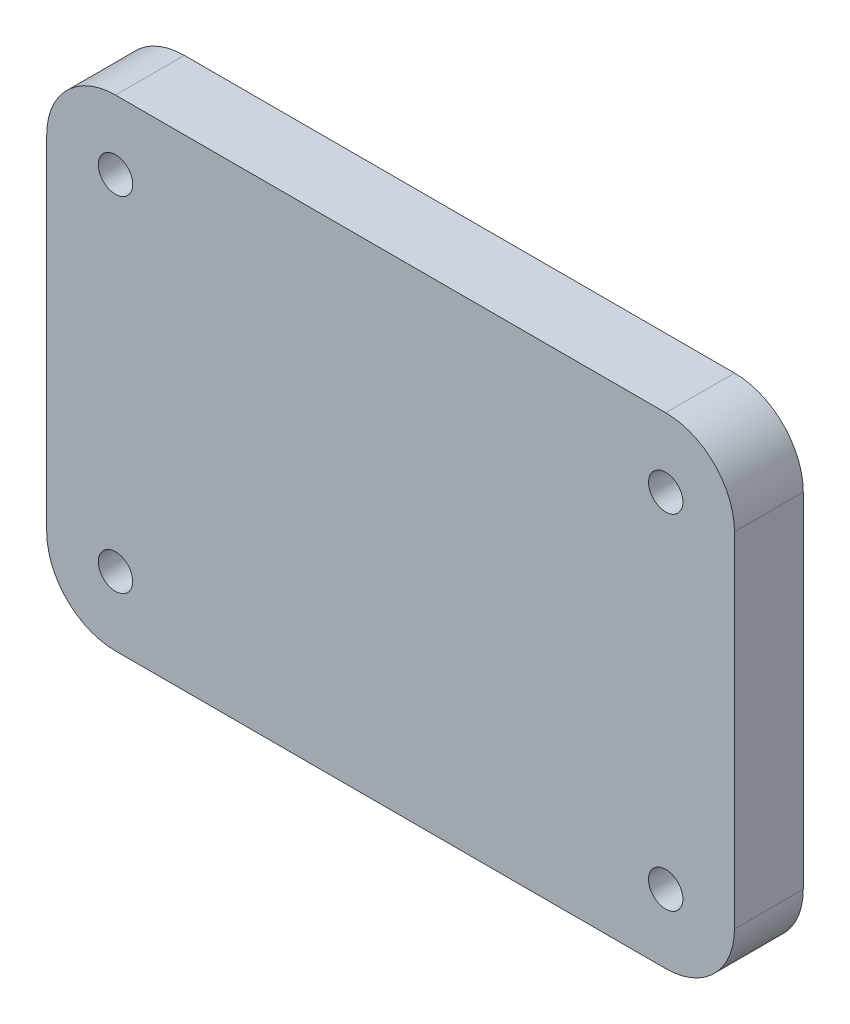
ISO-10303-21;
HEADER;
FILE_DESCRIPTION(('STEP AP214'),'2;1');
FILE_NAME('part.step','',(''),(''),'','','');
FILE_SCHEMA(('AUTOMOTIVE_DESIGN { 1 0 10303 214 1 1 1 1 }'));
ENDSEC;
DATA;
#1=APPLICATION_CONTEXT('core data for automotive mechanical design processes');
#2=APPLICATION_PROTOCOL_DEFINITION('international standard','automotive_design',2000,#1);
#3=PRODUCT_CONTEXT('',#1,'mechanical');
#4=PRODUCT('Part','Part','',(#3));
#5=PRODUCT_RELATED_PRODUCT_CATEGORY('part','',(#4));
#6=PRODUCT_DEFINITION_FORMATION('','',#4);
#7=PRODUCT_DEFINITION_CONTEXT('part definition',#1,'design');
#8=PRODUCT_DEFINITION('design','',#6,#7);
#9=PRODUCT_DEFINITION_SHAPE('','',#8);
#10=(LENGTH_UNIT() NAMED_UNIT(*) SI_UNIT(.MILLI.,.METRE.));
#11=(NAMED_UNIT(*) PLANE_ANGLE_UNIT() SI_UNIT($,.RADIAN.));
#12=(NAMED_UNIT(*) SI_UNIT($,.STERADIAN.) SOLID_ANGLE_UNIT());
#13=UNCERTAINTY_MEASURE_WITH_UNIT(LENGTH_MEASURE(1.E-05),#10,'distance_accuracy_value','');
#14=(GEOMETRIC_REPRESENTATION_CONTEXT(3) GLOBAL_UNCERTAINTY_ASSIGNED_CONTEXT((#13)) GLOBAL_UNIT_ASSIGNED_CONTEXT((#10,
#11,#12)) REPRESENTATION_CONTEXT('',''));
#15=CARTESIAN_POINT('',(0.,0.,0.));
#16=DIRECTION('',(0.,0.,1.));
#17=DIRECTION('',(1.,0.,0.));
#18=AXIS2_PLACEMENT_3D('',#15,#16,#17);
#19=CARTESIAN_POINT('',(-40.,-25.,10.));
#20=DIRECTION('',(0.,0.,1.));
#21=DIRECTION('',(1.,0.,0.));
#22=AXIS2_PLACEMENT_3D('',#19,#20,#21);
#23=PLANE('',#22);
#24=CARTESIAN_POINT('',(40.,-25.,10.));
#25=DIRECTION('',(0.,0.,1.));
#26=DIRECTION('',(-1.,0.,0.));
#27=AXIS2_PLACEMENT_3D('',#24,#25,#26);
#28=CIRCLE('',#27,2.5);
#29=CARTESIAN_POINT('',(37.5,-25.,10.));
#30=VERTEX_POINT('',#29);
#31=EDGE_CURVE('E190',#30,#30,#28,.T.);
#32=ORIENTED_EDGE('',*,*,#31,.F.);
#33=EDGE_LOOP('',(#32));
#34=FACE_BOUND('',#33,.T.);
#35=CARTESIAN_POINT('',(-40.,25.,10.));
#36=DIRECTION('',(0.,0.,1.));
#37=DIRECTION('',(1.,0.,0.));
#38=AXIS2_PLACEMENT_3D('',#35,#36,#37);
#39=CIRCLE('',#38,2.5);
#40=CARTESIAN_POINT('',(-37.5,25.,10.));
#41=VERTEX_POINT('',#40);
#42=EDGE_CURVE('E136',#41,#41,#39,.T.);
#43=ORIENTED_EDGE('',*,*,#42,.F.);
#44=EDGE_LOOP('',(#43));
#45=FACE_BOUND('',#44,.T.);
#46=CARTESIAN_POINT('',(-40.,-25.,10.));
#47=DIRECTION('',(0.,0.,1.));
#48=DIRECTION('',(1.,0.,0.));
#49=AXIS2_PLACEMENT_3D('',#46,#47,#48);
#50=CIRCLE('',#49,10.);
#51=CARTESIAN_POINT('',(-50.,-25.,10.));
#52=VERTEX_POINT('',#51);
#53=CARTESIAN_POINT('',(-40.,-35.,10.));
#54=VERTEX_POINT('',#53);
#55=EDGE_CURVE('E147',#52,#54,#50,.T.);
#56=ORIENTED_EDGE('',*,*,#55,.T.);
#57=DIRECTION('',(1.,0.,0.));
#58=VECTOR('',#57,1.);
#59=CARTESIAN_POINT('',(-40.,-35.,10.));
#60=LINE('',#59,#58);
#61=CARTESIAN_POINT('',(40.,-35.,10.));
#62=VERTEX_POINT('',#61);
#63=EDGE_CURVE('E95',#54,#62,#60,.T.);
#64=ORIENTED_EDGE('',*,*,#63,.T.);
#65=CARTESIAN_POINT('',(40.,-25.,10.));
#66=DIRECTION('',(0.,0.,1.));
#67=DIRECTION('',(-1.,0.,0.));
#68=AXIS2_PLACEMENT_3D('',#65,#66,#67);
#69=CIRCLE('',#68,10.);
#70=CARTESIAN_POINT('',(50.,-25.,10.));
#71=VERTEX_POINT('',#70);
#72=EDGE_CURVE('E162',#62,#71,#69,.T.);
#73=ORIENTED_EDGE('',*,*,#72,.T.);
#74=DIRECTION('',(0.,1.,0.));
#75=VECTOR('',#74,1.);
#76=CARTESIAN_POINT('',(50.,25.,10.));
#77=LINE('',#76,#75);
#78=CARTESIAN_POINT('',(50.,25.,10.));
#79=VERTEX_POINT('',#78);
#80=EDGE_CURVE('E175',#71,#79,#77,.T.);
#81=ORIENTED_EDGE('',*,*,#80,.T.);
#82=CARTESIAN_POINT('',(40.,25.,10.));
#83=DIRECTION('',(0.,0.,1.));
#84=DIRECTION('',(-1.,0.,0.));
#85=AXIS2_PLACEMENT_3D('',#82,#83,#84);
#86=CIRCLE('',#85,10.);
#87=CARTESIAN_POINT('',(40.,35.,10.));
#88=VERTEX_POINT('',#87);
#89=EDGE_CURVE('E114',#79,#88,#86,.T.);
#90=ORIENTED_EDGE('',*,*,#89,.T.);
#91=DIRECTION('',(-1.,0.,0.));
#92=VECTOR('',#91,1.);
#93=CARTESIAN_POINT('',(-40.,35.,10.));
#94=LINE('',#93,#92);
#95=CARTESIAN_POINT('',(-40.,35.,10.));
#96=VERTEX_POINT('',#95);
#97=EDGE_CURVE('E108',#88,#96,#94,.T.);
#98=ORIENTED_EDGE('',*,*,#97,.T.);
#99=CARTESIAN_POINT('',(-40.,25.,10.));
#100=DIRECTION('',(0.,0.,1.));
#101=DIRECTION('',(1.,0.,0.));
#102=AXIS2_PLACEMENT_3D('',#99,#100,#101);
#103=CIRCLE('',#102,9.99999999999999);
#104=CARTESIAN_POINT('',(-50.,25.,10.));
#105=VERTEX_POINT('',#104);
#106=EDGE_CURVE('E112',#96,#105,#103,.T.);
#107=ORIENTED_EDGE('',*,*,#106,.T.);
#108=DIRECTION('',(0.,-1.,0.));
#109=VECTOR('',#108,1.);
#110=CARTESIAN_POINT('',(-50.,25.,10.));
#111=LINE('',#110,#109);
#112=EDGE_CURVE('E52',#105,#52,#111,.T.);
#113=ORIENTED_EDGE('',*,*,#112,.T.);
#114=EDGE_LOOP('',(#56,#64,#73,#81,#90,#98,#107,#113));
#115=FACE_BOUND('',#114,.T.);
#116=CARTESIAN_POINT('',(-40.,-25.,10.));
#117=DIRECTION('',(0.,0.,1.));
#118=DIRECTION('',(1.,0.,0.));
#119=AXIS2_PLACEMENT_3D('',#116,#117,#118);
#120=CIRCLE('',#119,2.5);
#121=CARTESIAN_POINT('',(-37.5,-25.,10.));
#122=VERTEX_POINT('',#121);
#123=EDGE_CURVE('E184',#122,#122,#120,.T.);
#124=ORIENTED_EDGE('',*,*,#123,.F.);
#125=EDGE_LOOP('',(#124));
#126=FACE_BOUND('',#125,.T.);
#127=CARTESIAN_POINT('',(40.,25.,10.));
#128=DIRECTION('',(0.,0.,1.));
#129=DIRECTION('',(-1.,0.,0.));
#130=AXIS2_PLACEMENT_3D('',#127,#128,#129);
#131=CIRCLE('',#130,2.5);
#132=CARTESIAN_POINT('',(37.5,25.,10.));
#133=VERTEX_POINT('',#132);
#134=EDGE_CURVE('E196',#133,#133,#131,.T.);
#135=ORIENTED_EDGE('',*,*,#134,.F.);
#136=EDGE_LOOP('',(#135));
#137=FACE_BOUND('',#136,.T.);
#138=ADVANCED_FACE('F35',(#34,#45,#115,#126,#137),#23,.T.);
#139=CARTESIAN_POINT('',(-40.,-25.,0.));
#140=DIRECTION('',(0.,0.,1.));
#141=DIRECTION('',(1.,0.,0.));
#142=AXIS2_PLACEMENT_3D('',#139,#140,#141);
#143=PLANE('',#142);
#144=CARTESIAN_POINT('',(-40.,-25.,0.));
#145=DIRECTION('',(0.,0.,1.));
#146=DIRECTION('',(1.,0.,0.));
#147=AXIS2_PLACEMENT_3D('',#144,#145,#146);
#148=CIRCLE('',#147,10.);
#149=CARTESIAN_POINT('',(-50.,-25.,0.));
#150=VERTEX_POINT('',#149);
#151=CARTESIAN_POINT('',(-40.,-35.,0.));
#152=VERTEX_POINT('',#151);
#153=EDGE_CURVE('E132',#150,#152,#148,.T.);
#154=ORIENTED_EDGE('',*,*,#153,.F.);
#155=DIRECTION('',(0.,-1.,0.));
#156=VECTOR('',#155,1.);
#157=CARTESIAN_POINT('',(-50.,25.,0.));
#158=LINE('',#157,#156);
#159=CARTESIAN_POINT('',(-50.,25.,0.));
#160=VERTEX_POINT('',#159);
#161=EDGE_CURVE('E87',#160,#150,#158,.T.);
#162=ORIENTED_EDGE('',*,*,#161,.F.);
#163=CARTESIAN_POINT('',(-40.,25.,0.));
#164=DIRECTION('',(0.,0.,1.));
#165=DIRECTION('',(1.,0.,0.));
#166=AXIS2_PLACEMENT_3D('',#163,#164,#165);
#167=CIRCLE('',#166,9.99999999999999);
#168=CARTESIAN_POINT('',(-40.,35.,0.));
#169=VERTEX_POINT('',#168);
#170=EDGE_CURVE('E81',#169,#160,#167,.T.);
#171=ORIENTED_EDGE('',*,*,#170,.F.);
#172=DIRECTION('',(-1.,0.,0.));
#173=VECTOR('',#172,1.);
#174=CARTESIAN_POINT('',(-40.,35.,0.));
#175=LINE('',#174,#173);
#176=CARTESIAN_POINT('',(40.,35.,0.));
#177=VERTEX_POINT('',#176);
#178=EDGE_CURVE('E122',#177,#169,#175,.T.);
#179=ORIENTED_EDGE('',*,*,#178,.F.);
#180=CARTESIAN_POINT('',(40.,25.,0.));
#181=DIRECTION('',(0.,0.,1.));
#182=DIRECTION('',(-1.,0.,0.));
#183=AXIS2_PLACEMENT_3D('',#180,#181,#182);
#184=CIRCLE('',#183,10.);
#185=CARTESIAN_POINT('',(50.,25.,0.));
#186=VERTEX_POINT('',#185);
#187=EDGE_CURVE('E142',#186,#177,#184,.T.);
#188=ORIENTED_EDGE('',*,*,#187,.F.);
#189=DIRECTION('',(0.,1.,0.));
#190=VECTOR('',#189,1.);
#191=CARTESIAN_POINT('',(50.,25.,0.));
#192=LINE('',#191,#190);
#193=CARTESIAN_POINT('',(50.,-25.,0.));
#194=VERTEX_POINT('',#193);
#195=EDGE_CURVE('E140',#194,#186,#192,.T.);
#196=ORIENTED_EDGE('',*,*,#195,.F.);
#197=CARTESIAN_POINT('',(40.,-25.,0.));
#198=DIRECTION('',(0.,0.,1.));
#199=DIRECTION('',(-1.,0.,0.));
#200=AXIS2_PLACEMENT_3D('',#197,#198,#199);
#201=CIRCLE('',#200,10.);
#202=CARTESIAN_POINT('',(40.,-35.,0.));
#203=VERTEX_POINT('',#202);
#204=EDGE_CURVE('E138',#203,#194,#201,.T.);
#205=ORIENTED_EDGE('',*,*,#204,.F.);
#206=DIRECTION('',(1.,0.,0.));
#207=VECTOR('',#206,1.);
#208=CARTESIAN_POINT('',(-40.,-35.,0.));
#209=LINE('',#208,#207);
#210=EDGE_CURVE('E135',#152,#203,#209,.T.);
#211=ORIENTED_EDGE('',*,*,#210,.F.);
#212=EDGE_LOOP('',(#154,#162,#171,#179,#188,#196,#205,#211));
#213=FACE_BOUND('',#212,.T.);
#214=CARTESIAN_POINT('',(-40.,25.,0.));
#215=DIRECTION('',(0.,0.,1.));
#216=DIRECTION('',(1.,0.,0.));
#217=AXIS2_PLACEMENT_3D('',#214,#215,#216);
#218=CIRCLE('',#217,2.5);
#219=CARTESIAN_POINT('',(-37.5,25.,0.));
#220=VERTEX_POINT('',#219);
#221=EDGE_CURVE('E181',#220,#220,#218,.T.);
#222=ORIENTED_EDGE('',*,*,#221,.T.);
#223=EDGE_LOOP('',(#222));
#224=FACE_BOUND('',#223,.T.);
#225=CARTESIAN_POINT('',(-40.,-25.,0.));
#226=DIRECTION('',(0.,0.,1.));
#227=DIRECTION('',(1.,0.,0.));
#228=AXIS2_PLACEMENT_3D('',#225,#226,#227);
#229=CIRCLE('',#228,2.5);
#230=CARTESIAN_POINT('',(-37.5,-25.,0.));
#231=VERTEX_POINT('',#230);
#232=EDGE_CURVE('E187',#231,#231,#229,.T.);
#233=ORIENTED_EDGE('',*,*,#232,.T.);
#234=EDGE_LOOP('',(#233));
#235=FACE_BOUND('',#234,.T.);
#236=CARTESIAN_POINT('',(40.,-25.,0.));
#237=DIRECTION('',(0.,0.,1.));
#238=DIRECTION('',(-1.,0.,0.));
#239=AXIS2_PLACEMENT_3D('',#236,#237,#238);
#240=CIRCLE('',#239,2.5);
#241=CARTESIAN_POINT('',(37.5,-25.,0.));
#242=VERTEX_POINT('',#241);
#243=EDGE_CURVE('E193',#242,#242,#240,.T.);
#244=ORIENTED_EDGE('',*,*,#243,.T.);
#245=EDGE_LOOP('',(#244));
#246=FACE_BOUND('',#245,.T.);
#247=CARTESIAN_POINT('',(40.,25.,0.));
#248=DIRECTION('',(0.,0.,1.));
#249=DIRECTION('',(-1.,0.,0.));
#250=AXIS2_PLACEMENT_3D('',#247,#248,#249);
#251=CIRCLE('',#250,2.5);
#252=CARTESIAN_POINT('',(37.5,25.,0.));
#253=VERTEX_POINT('',#252);
#254=EDGE_CURVE('E199',#253,#253,#251,.T.);
#255=ORIENTED_EDGE('',*,*,#254,.T.);
#256=EDGE_LOOP('',(#255));
#257=FACE_BOUND('',#256,.T.);
#258=ADVANCED_FACE('F166',(#213,#224,#235,#246,#257),#143,.F.);
#259=CARTESIAN_POINT('',(-40.,-25.,10.));
#260=DIRECTION('',(0.,0.,-1.));
#261=DIRECTION('',(-1.,0.,0.));
#262=AXIS2_PLACEMENT_3D('',#259,#260,#261);
#263=CYLINDRICAL_SURFACE('',#262,10.);
#264=ORIENTED_EDGE('',*,*,#153,.T.);
#265=DIRECTION('',(0.,0.,-1.));
#266=VECTOR('',#265,1.);
#267=CARTESIAN_POINT('',(-40.,-35.,10.));
#268=LINE('',#267,#266);
#269=EDGE_CURVE('E11',#54,#152,#268,.T.);
#270=ORIENTED_EDGE('',*,*,#269,.F.);
#271=ORIENTED_EDGE('',*,*,#55,.F.);
#272=DIRECTION('',(0.,0.,-1.));
#273=VECTOR('',#272,1.);
#274=CARTESIAN_POINT('',(-50.,-25.,10.));
#275=LINE('',#274,#273);
#276=EDGE_CURVE('E128',#52,#150,#275,.T.);
#277=ORIENTED_EDGE('',*,*,#276,.T.);
#278=EDGE_LOOP('',(#264,#270,#271,#277));
#279=FACE_BOUND('',#278,.T.);
#280=ADVANCED_FACE('F37',(#279),#263,.T.);
#281=CARTESIAN_POINT('',(-40.,-35.,10.));
#282=DIRECTION('',(0.,1.,0.));
#283=DIRECTION('',(-1.,0.,0.));
#284=AXIS2_PLACEMENT_3D('',#281,#282,#283);
#285=PLANE('',#284);
#286=ORIENTED_EDGE('',*,*,#210,.T.);
#287=DIRECTION('',(0.,0.,-1.));
#288=VECTOR('',#287,1.);
#289=CARTESIAN_POINT('',(40.,-35.,10.));
#290=LINE('',#289,#288);
#291=EDGE_CURVE('E44',#62,#203,#290,.T.);
#292=ORIENTED_EDGE('',*,*,#291,.F.);
#293=ORIENTED_EDGE('',*,*,#63,.F.);
#294=ORIENTED_EDGE('',*,*,#269,.T.);
#295=EDGE_LOOP('',(#286,#292,#293,#294));
#296=FACE_BOUND('',#295,.T.);
#297=ADVANCED_FACE('F233',(#296),#285,.F.);
#298=CARTESIAN_POINT('',(40.,-25.,10.));
#299=DIRECTION('',(0.,0.,-1.));
#300=DIRECTION('',(-1.,0.,0.));
#301=AXIS2_PLACEMENT_3D('',#298,#299,#300);
#302=CYLINDRICAL_SURFACE('',#301,10.);
#303=ORIENTED_EDGE('',*,*,#204,.T.);
#304=DIRECTION('',(0.,0.,-1.));
#305=VECTOR('',#304,1.);
#306=CARTESIAN_POINT('',(50.,-25.,10.));
#307=LINE('',#306,#305);
#308=EDGE_CURVE('E154',#71,#194,#307,.T.);
#309=ORIENTED_EDGE('',*,*,#308,.F.);
#310=ORIENTED_EDGE('',*,*,#72,.F.);
#311=ORIENTED_EDGE('',*,*,#291,.T.);
#312=EDGE_LOOP('',(#303,#309,#310,#311));
#313=FACE_BOUND('',#312,.T.);
#314=ADVANCED_FACE('F160',(#313),#302,.T.);
#315=CARTESIAN_POINT('',(50.,25.,10.));
#316=DIRECTION('',(-1.,0.,0.));
#317=DIRECTION('',(0.,-1.,0.));
#318=AXIS2_PLACEMENT_3D('',#315,#316,#317);
#319=PLANE('',#318);
#320=ORIENTED_EDGE('',*,*,#195,.T.);
#321=DIRECTION('',(0.,0.,-1.));
#322=VECTOR('',#321,1.);
#323=CARTESIAN_POINT('',(50.,25.,10.));
#324=LINE('',#323,#322);
#325=EDGE_CURVE('E151',#79,#186,#324,.T.);
#326=ORIENTED_EDGE('',*,*,#325,.F.);
#327=ORIENTED_EDGE('',*,*,#80,.F.);
#328=ORIENTED_EDGE('',*,*,#308,.T.);
#329=EDGE_LOOP('',(#320,#326,#327,#328));
#330=FACE_BOUND('',#329,.T.);
#331=ADVANCED_FACE('F171',(#330),#319,.F.);
#332=CARTESIAN_POINT('',(40.,25.,10.));
#333=DIRECTION('',(0.,0.,-1.));
#334=DIRECTION('',(-1.,0.,0.));
#335=AXIS2_PLACEMENT_3D('',#332,#333,#334);
#336=CYLINDRICAL_SURFACE('',#335,10.);
#337=ORIENTED_EDGE('',*,*,#187,.T.);
#338=DIRECTION('',(0.,0.,-1.));
#339=VECTOR('',#338,1.);
#340=CARTESIAN_POINT('',(40.,35.,10.));
#341=LINE('',#340,#339);
#342=EDGE_CURVE('E123',#88,#177,#341,.T.);
#343=ORIENTED_EDGE('',*,*,#342,.F.);
#344=ORIENTED_EDGE('',*,*,#89,.F.);
#345=ORIENTED_EDGE('',*,*,#325,.T.);
#346=EDGE_LOOP('',(#337,#343,#344,#345));
#347=FACE_BOUND('',#346,.T.);
#348=ADVANCED_FACE('F174',(#347),#336,.T.);
#349=CARTESIAN_POINT('',(-40.,35.,10.));
#350=DIRECTION('',(0.,-1.,0.));
#351=DIRECTION('',(1.,0.,0.));
#352=AXIS2_PLACEMENT_3D('',#349,#350,#351);
#353=PLANE('',#352);
#354=ORIENTED_EDGE('',*,*,#178,.T.);
#355=DIRECTION('',(0.,0.,-1.));
#356=VECTOR('',#355,1.);
#357=CARTESIAN_POINT('',(-40.,35.,10.));
#358=LINE('',#357,#356);
#359=EDGE_CURVE('E119',#96,#169,#358,.T.);
#360=ORIENTED_EDGE('',*,*,#359,.F.);
#361=ORIENTED_EDGE('',*,*,#97,.F.);
#362=ORIENTED_EDGE('',*,*,#342,.T.);
#363=EDGE_LOOP('',(#354,#360,#361,#362));
#364=FACE_BOUND('',#363,.T.);
#365=ADVANCED_FACE('F120',(#364),#353,.F.);
#366=CARTESIAN_POINT('',(-40.,25.,10.));
#367=DIRECTION('',(0.,0.,-1.));
#368=DIRECTION('',(-1.,0.,0.));
#369=AXIS2_PLACEMENT_3D('',#366,#367,#368);
#370=CYLINDRICAL_SURFACE('',#369,9.99999999999999);
#371=ORIENTED_EDGE('',*,*,#170,.T.);
#372=DIRECTION('',(0.,0.,-1.));
#373=VECTOR('',#372,1.);
#374=CARTESIAN_POINT('',(-50.,25.,10.));
#375=LINE('',#374,#373);
#376=EDGE_CURVE('E124',#105,#160,#375,.T.);
#377=ORIENTED_EDGE('',*,*,#376,.F.);
#378=ORIENTED_EDGE('',*,*,#106,.F.);
#379=ORIENTED_EDGE('',*,*,#359,.T.);
#380=EDGE_LOOP('',(#371,#377,#378,#379));
#381=FACE_BOUND('',#380,.T.);
#382=ADVANCED_FACE('F126',(#381),#370,.T.);
#383=CARTESIAN_POINT('',(-50.,25.,10.));
#384=DIRECTION('',(1.,0.,0.));
#385=DIRECTION('',(0.,1.,0.));
#386=AXIS2_PLACEMENT_3D('',#383,#384,#385);
#387=PLANE('',#386);
#388=ORIENTED_EDGE('',*,*,#161,.T.);
#389=ORIENTED_EDGE('',*,*,#276,.F.);
#390=ORIENTED_EDGE('',*,*,#112,.F.);
#391=ORIENTED_EDGE('',*,*,#376,.T.);
#392=EDGE_LOOP('',(#388,#389,#390,#391));
#393=FACE_BOUND('',#392,.T.);
#394=ADVANCED_FACE('F221',(#393),#387,.F.);
#395=CARTESIAN_POINT('',(-40.,25.,10.));
#396=DIRECTION('',(0.,0.,-1.));
#397=DIRECTION('',(-1.,0.,0.));
#398=AXIS2_PLACEMENT_3D('',#395,#396,#397);
#399=CYLINDRICAL_SURFACE('',#398,2.5);
#400=ORIENTED_EDGE('',*,*,#42,.T.);
#401=EDGE_LOOP('',(#400));
#402=FACE_BOUND('',#401,.T.);
#403=ORIENTED_EDGE('',*,*,#221,.F.);
#404=EDGE_LOOP('',(#403));
#405=FACE_BOUND('',#404,.T.);
#406=ADVANCED_FACE('F218',(#402,#405),#399,.F.);
#407=CARTESIAN_POINT('',(-40.,-25.,10.));
#408=DIRECTION('',(0.,0.,-1.));
#409=DIRECTION('',(-1.,0.,0.));
#410=AXIS2_PLACEMENT_3D('',#407,#408,#409);
#411=CYLINDRICAL_SURFACE('',#410,2.5);
#412=ORIENTED_EDGE('',*,*,#123,.T.);
#413=EDGE_LOOP('',(#412));
#414=FACE_BOUND('',#413,.T.);
#415=ORIENTED_EDGE('',*,*,#232,.F.);
#416=EDGE_LOOP('',(#415));
#417=FACE_BOUND('',#416,.T.);
#418=ADVANCED_FACE('F297',(#414,#417),#411,.F.);
#419=CARTESIAN_POINT('',(40.,-25.,10.));
#420=DIRECTION('',(0.,0.,-1.));
#421=DIRECTION('',(-1.,0.,0.));
#422=AXIS2_PLACEMENT_3D('',#419,#420,#421);
#423=CYLINDRICAL_SURFACE('',#422,2.5);
#424=ORIENTED_EDGE('',*,*,#31,.T.);
#425=EDGE_LOOP('',(#424));
#426=FACE_BOUND('',#425,.T.);
#427=ORIENTED_EDGE('',*,*,#243,.F.);
#428=EDGE_LOOP('',(#427));
#429=FACE_BOUND('',#428,.T.);
#430=ADVANCED_FACE('F305',(#426,#429),#423,.F.);
#431=CARTESIAN_POINT('',(40.,25.,10.));
#432=DIRECTION('',(0.,0.,-1.));
#433=DIRECTION('',(-1.,0.,0.));
#434=AXIS2_PLACEMENT_3D('',#431,#432,#433);
#435=CYLINDRICAL_SURFACE('',#434,2.5);
#436=ORIENTED_EDGE('',*,*,#134,.T.);
#437=EDGE_LOOP('',(#436));
#438=FACE_BOUND('',#437,.T.);
#439=ORIENTED_EDGE('',*,*,#254,.F.);
#440=EDGE_LOOP('',(#439));
#441=FACE_BOUND('',#440,.T.);
#442=ADVANCED_FACE('F205',(#438,#441),#435,.F.);
#443=CLOSED_SHELL('',(#138,#258,#280,#297,#314,#331,#348,#365,#382,#394,#406,#418,#430,#442));
#444=MANIFOLD_SOLID_BREP('B2',#443);
#445=ADVANCED_BREP_SHAPE_REPRESENTATION('',(#18,#444),#14);
#446=SHAPE_DEFINITION_REPRESENTATION(#9,#445);
ENDSEC;
END-ISO-10303-21;
